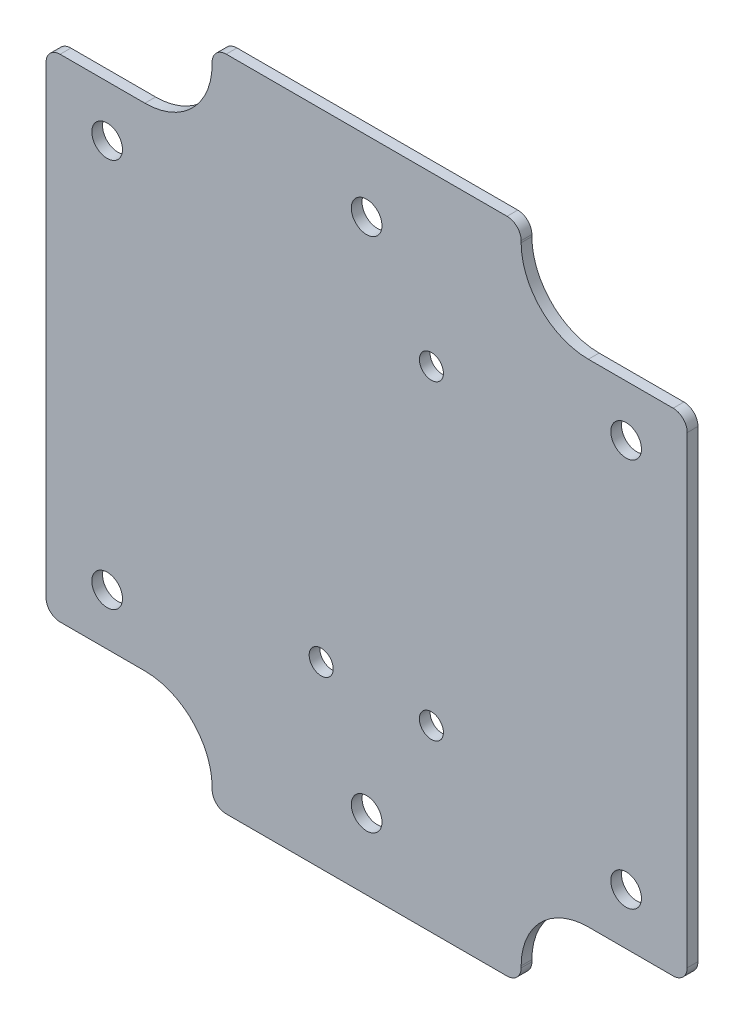
ISO-10303-21;
HEADER;
FILE_DESCRIPTION(('STEP AP214'),'2;1');
FILE_NAME('part.step','',(''),(''),'','','');
FILE_SCHEMA(('AUTOMOTIVE_DESIGN { 1 0 10303 214 1 1 1 1 }'));
ENDSEC;
DATA;
#1=APPLICATION_CONTEXT('core data for automotive mechanical design processes');
#2=APPLICATION_PROTOCOL_DEFINITION('international standard','automotive_design',2000,#1);
#3=PRODUCT_CONTEXT('',#1,'mechanical');
#4=PRODUCT('Part','Part','',(#3));
#5=PRODUCT_RELATED_PRODUCT_CATEGORY('part','',(#4));
#6=PRODUCT_DEFINITION_FORMATION('','',#4);
#7=PRODUCT_DEFINITION_CONTEXT('part definition',#1,'design');
#8=PRODUCT_DEFINITION('design','',#6,#7);
#9=PRODUCT_DEFINITION_SHAPE('','',#8);
#10=(LENGTH_UNIT() NAMED_UNIT(*) SI_UNIT(.MILLI.,.METRE.));
#11=(NAMED_UNIT(*) PLANE_ANGLE_UNIT() SI_UNIT($,.RADIAN.));
#12=(NAMED_UNIT(*) SI_UNIT($,.STERADIAN.) SOLID_ANGLE_UNIT());
#13=UNCERTAINTY_MEASURE_WITH_UNIT(LENGTH_MEASURE(1.E-05),#10,'distance_accuracy_value','');
#14=(GEOMETRIC_REPRESENTATION_CONTEXT(3) GLOBAL_UNCERTAINTY_ASSIGNED_CONTEXT((#13)) GLOBAL_UNIT_ASSIGNED_CONTEXT((#10,
#11,#12)) REPRESENTATION_CONTEXT('',''));
#15=CARTESIAN_POINT('',(0.,0.,0.));
#16=DIRECTION('',(0.,0.,1.));
#17=DIRECTION('',(1.,0.,0.));
#18=AXIS2_PLACEMENT_3D('',#15,#16,#17);
#19=CARTESIAN_POINT('',(0.,0.,1.2));
#20=DIRECTION('',(0.,0.,1.));
#21=DIRECTION('',(1.,0.,0.));
#22=AXIS2_PLACEMENT_3D('',#19,#20,#21);
#23=PLANE('',#22);
#24=CARTESIAN_POINT('',(30.7594,-16.76,1.2));
#25=DIRECTION('',(0.,0.,1.));
#26=DIRECTION('',(1.,0.,0.));
#27=AXIS2_PLACEMENT_3D('',#24,#25,#26);
#28=CIRCLE('',#27,1.345);
#29=CARTESIAN_POINT('',(32.1044,-16.76,1.2));
#30=VERTEX_POINT('',#29);
#31=EDGE_CURVE('E552',#30,#30,#28,.T.);
#32=ORIENTED_EDGE('',*,*,#31,.F.);
#33=EDGE_LOOP('',(#32));
#34=FACE_BOUND('',#33,.T.);
#35=CARTESIAN_POINT('',(43.0794,-16.76,1.2));
#36=DIRECTION('',(0.,0.,1.));
#37=DIRECTION('',(1.,0.,0.));
#38=AXIS2_PLACEMENT_3D('',#35,#36,#37);
#39=CIRCLE('',#38,1.345);
#40=CARTESIAN_POINT('',(44.4244,-16.76,1.2));
#41=VERTEX_POINT('',#40);
#42=EDGE_CURVE('E545',#41,#41,#39,.T.);
#43=ORIENTED_EDGE('',*,*,#42,.F.);
#44=EDGE_LOOP('',(#43));
#45=FACE_BOUND('',#44,.T.);
#46=CARTESIAN_POINT('',(43.0794,18.02,1.2));
#47=DIRECTION('',(0.,0.,1.));
#48=DIRECTION('',(1.,0.,0.));
#49=AXIS2_PLACEMENT_3D('',#46,#47,#48);
#50=CIRCLE('',#49,1.345);
#51=CARTESIAN_POINT('',(44.4244,18.02,1.2));
#52=VERTEX_POINT('',#51);
#53=EDGE_CURVE('E546',#52,#52,#50,.T.);
#54=ORIENTED_EDGE('',*,*,#53,.F.);
#55=EDGE_LOOP('',(#54));
#56=FACE_BOUND('',#55,.T.);
#57=CARTESIAN_POINT('',(35.8394,-28.8671,1.2));
#58=DIRECTION('',(0.,0.,1.));
#59=DIRECTION('',(1.,0.,0.));
#60=AXIS2_PLACEMENT_3D('',#57,#58,#59);
#61=CIRCLE('',#60,1.7145);
#62=CARTESIAN_POINT('',(37.5539,-28.8671,1.2));
#63=VERTEX_POINT('',#62);
#64=EDGE_CURVE('E527',#63,#63,#61,.T.);
#65=ORIENTED_EDGE('',*,*,#64,.F.);
#66=EDGE_LOOP('',(#65));
#67=FACE_BOUND('',#66,.T.);
#68=CARTESIAN_POINT('',(6.8326,21.7424,1.2));
#69=DIRECTION('',(0.,0.,1.));
#70=DIRECTION('',(1.,0.,0.));
#71=AXIS2_PLACEMENT_3D('',#68,#69,#70);
#72=CIRCLE('',#71,1.7145);
#73=CARTESIAN_POINT('',(8.5471,21.7424,1.2));
#74=VERTEX_POINT('',#73);
#75=EDGE_CURVE('E515',#74,#74,#72,.T.);
#76=ORIENTED_EDGE('',*,*,#75,.F.);
#77=EDGE_LOOP('',(#76));
#78=FACE_BOUND('',#77,.T.);
#79=CARTESIAN_POINT('',(64.8462,-21.7424,1.2));
#80=DIRECTION('',(0.,0.,1.));
#81=DIRECTION('',(1.,0.,0.));
#82=AXIS2_PLACEMENT_3D('',#79,#80,#81);
#83=CIRCLE('',#82,1.7145);
#84=CARTESIAN_POINT('',(66.5607,-21.7424,1.2));
#85=VERTEX_POINT('',#84);
#86=EDGE_CURVE('E226',#85,#85,#83,.T.);
#87=ORIENTED_EDGE('',*,*,#86,.F.);
#88=EDGE_LOOP('',(#87));
#89=FACE_BOUND('',#88,.T.);
#90=DIRECTION('',(0.,-1.,0.));
#91=VECTOR('',#90,1.);
#92=CARTESIAN_POINT('',(18.5674,-36.7792,1.2));
#93=LINE('',#92,#91);
#94=CARTESIAN_POINT('',(18.5674,-35.0012,1.2));
#95=VERTEX_POINT('',#94);
#96=CARTESIAN_POINT('',(18.5674,-35.2044,1.2));
#97=VERTEX_POINT('',#96);
#98=EDGE_CURVE('E386',#95,#97,#93,.T.);
#99=ORIENTED_EDGE('',*,*,#98,.T.);
#100=CARTESIAN_POINT('',(20.1422,-35.2044,1.2));
#101=DIRECTION('',(0.,0.,1.));
#102=DIRECTION('',(1.,0.,0.));
#103=AXIS2_PLACEMENT_3D('',#100,#101,#102);
#104=CIRCLE('',#103,1.5748);
#105=CARTESIAN_POINT('',(20.1422,-36.7792,1.2));
#106=VERTEX_POINT('',#105);
#107=EDGE_CURVE('E330',#97,#106,#104,.T.);
#108=ORIENTED_EDGE('',*,*,#107,.T.);
#109=DIRECTION('',(1.,0.,0.));
#110=VECTOR('',#109,1.);
#111=CARTESIAN_POINT('',(53.1114,-36.7792,1.2));
#112=LINE('',#111,#110);
#113=CARTESIAN_POINT('',(51.5366,-36.7792,1.2));
#114=VERTEX_POINT('',#113);
#115=EDGE_CURVE('E388',#106,#114,#112,.T.);
#116=ORIENTED_EDGE('',*,*,#115,.T.);
#117=CARTESIAN_POINT('',(51.5366,-35.2044,1.2));
#118=DIRECTION('',(0.,0.,1.));
#119=DIRECTION('',(1.,0.,0.));
#120=AXIS2_PLACEMENT_3D('',#117,#118,#119);
#121=CIRCLE('',#120,1.5748);
#122=CARTESIAN_POINT('',(53.1114,-35.2044,1.2));
#123=VERTEX_POINT('',#122);
#124=EDGE_CURVE('E328',#114,#123,#121,.T.);
#125=ORIENTED_EDGE('',*,*,#124,.T.);
#126=DIRECTION('',(0.,1.,0.));
#127=VECTOR('',#126,1.);
#128=CARTESIAN_POINT('',(53.1114,-27.4828,1.2));
#129=LINE('',#128,#127);
#130=CARTESIAN_POINT('',(53.1114,-35.0012,1.2));
#131=VERTEX_POINT('',#130);
#132=EDGE_CURVE('E218',#123,#131,#129,.T.);
#133=ORIENTED_EDGE('',*,*,#132,.T.);
#134=CARTESIAN_POINT('',(60.6298,-35.0012,1.2));
#135=DIRECTION('',(0.,0.,1.));
#136=DIRECTION('',(1.,0.,0.));
#137=AXIS2_PLACEMENT_3D('',#134,#135,#136);
#138=CIRCLE('',#137,7.5184);
#139=CARTESIAN_POINT('',(60.6298,-27.4828,1.2));
#140=VERTEX_POINT('',#139);
#141=EDGE_CURVE('E207',#131,#140,#138,.F.);
#142=ORIENTED_EDGE('',*,*,#141,.T.);
#143=DIRECTION('',(1.,0.,0.));
#144=VECTOR('',#143,1.);
#145=CARTESIAN_POINT('',(71.6788,-27.4828,1.2));
#146=LINE('',#145,#144);
#147=CARTESIAN_POINT('',(70.104,-27.4828,1.2));
#148=VERTEX_POINT('',#147);
#149=EDGE_CURVE('E217',#140,#148,#146,.T.);
#150=ORIENTED_EDGE('',*,*,#149,.T.);
#151=CARTESIAN_POINT('',(70.104,-25.908,1.2));
#152=DIRECTION('',(0.,0.,1.));
#153=DIRECTION('',(1.,0.,0.));
#154=AXIS2_PLACEMENT_3D('',#151,#152,#153);
#155=CIRCLE('',#154,1.5748);
#156=CARTESIAN_POINT('',(71.6788,-25.908,1.2));
#157=VERTEX_POINT('',#156);
#158=EDGE_CURVE('E326',#148,#157,#155,.T.);
#159=ORIENTED_EDGE('',*,*,#158,.T.);
#160=DIRECTION('',(0.,1.,0.));
#161=VECTOR('',#160,1.);
#162=CARTESIAN_POINT('',(71.6788,-27.4828,1.2));
#163=LINE('',#162,#161);
#164=CARTESIAN_POINT('',(71.6788,25.908,1.2));
#165=VERTEX_POINT('',#164);
#166=EDGE_CURVE('E505',#157,#165,#163,.T.);
#167=ORIENTED_EDGE('',*,*,#166,.T.);
#168=CARTESIAN_POINT('',(70.104,25.908,1.2));
#169=DIRECTION('',(0.,0.,1.));
#170=DIRECTION('',(1.,0.,0.));
#171=AXIS2_PLACEMENT_3D('',#168,#169,#170);
#172=CIRCLE('',#171,1.5748);
#173=CARTESIAN_POINT('',(70.104,27.4828,1.2));
#174=VERTEX_POINT('',#173);
#175=EDGE_CURVE('E324',#165,#174,#172,.T.);
#176=ORIENTED_EDGE('',*,*,#175,.T.);
#177=DIRECTION('',(-1.,0.,0.));
#178=VECTOR('',#177,1.);
#179=CARTESIAN_POINT('',(71.6788,27.4828,1.2));
#180=LINE('',#179,#178);
#181=CARTESIAN_POINT('',(60.6298,27.4828,1.2));
#182=VERTEX_POINT('',#181);
#183=EDGE_CURVE('E501',#174,#182,#180,.T.);
#184=ORIENTED_EDGE('',*,*,#183,.T.);
#185=CARTESIAN_POINT('',(60.6298,35.0012,1.2));
#186=DIRECTION('',(0.,0.,1.));
#187=DIRECTION('',(1.,0.,0.));
#188=AXIS2_PLACEMENT_3D('',#185,#186,#187);
#189=CIRCLE('',#188,7.5184);
#190=CARTESIAN_POINT('',(53.1114,35.0012,1.2));
#191=VERTEX_POINT('',#190);
#192=EDGE_CURVE('E288',#182,#191,#189,.F.);
#193=ORIENTED_EDGE('',*,*,#192,.T.);
#194=DIRECTION('',(0.,1.,0.));
#195=VECTOR('',#194,1.);
#196=CARTESIAN_POINT('',(53.1114,27.4828,1.2));
#197=LINE('',#196,#195);
#198=CARTESIAN_POINT('',(53.1114,35.2044,1.2));
#199=VERTEX_POINT('',#198);
#200=EDGE_CURVE('E498',#191,#199,#197,.T.);
#201=ORIENTED_EDGE('',*,*,#200,.T.);
#202=CARTESIAN_POINT('',(51.5366,35.2044,1.2));
#203=DIRECTION('',(0.,0.,1.));
#204=DIRECTION('',(1.,0.,0.));
#205=AXIS2_PLACEMENT_3D('',#202,#203,#204);
#206=CIRCLE('',#205,1.5748);
#207=CARTESIAN_POINT('',(51.5366,36.7792,1.2));
#208=VERTEX_POINT('',#207);
#209=EDGE_CURVE('E322',#199,#208,#206,.T.);
#210=ORIENTED_EDGE('',*,*,#209,.T.);
#211=DIRECTION('',(-1.,0.,0.));
#212=VECTOR('',#211,1.);
#213=CARTESIAN_POINT('',(53.1114,36.7792,1.2));
#214=LINE('',#213,#212);
#215=CARTESIAN_POINT('',(20.1422,36.7792,1.2));
#216=VERTEX_POINT('',#215);
#217=EDGE_CURVE('E494',#208,#216,#214,.T.);
#218=ORIENTED_EDGE('',*,*,#217,.T.);
#219=CARTESIAN_POINT('',(20.1422,35.2044,1.2));
#220=DIRECTION('',(0.,0.,1.));
#221=DIRECTION('',(1.,0.,0.));
#222=AXIS2_PLACEMENT_3D('',#219,#220,#221);
#223=CIRCLE('',#222,1.5748);
#224=CARTESIAN_POINT('',(18.5674,35.2044,1.2));
#225=VERTEX_POINT('',#224);
#226=EDGE_CURVE('E320',#216,#225,#223,.T.);
#227=ORIENTED_EDGE('',*,*,#226,.T.);
#228=DIRECTION('',(0.,-1.,0.));
#229=VECTOR('',#228,1.);
#230=CARTESIAN_POINT('',(18.5674,36.7792,1.2));
#231=LINE('',#230,#229);
#232=CARTESIAN_POINT('',(18.5674,35.0012,1.2));
#233=VERTEX_POINT('',#232);
#234=EDGE_CURVE('E372',#225,#233,#231,.T.);
#235=ORIENTED_EDGE('',*,*,#234,.T.);
#236=CARTESIAN_POINT('',(11.049,35.0012,1.2));
#237=DIRECTION('',(0.,0.,1.));
#238=DIRECTION('',(1.,0.,0.));
#239=AXIS2_PLACEMENT_3D('',#236,#237,#238);
#240=CIRCLE('',#239,7.5184);
#241=CARTESIAN_POINT('',(11.049,27.4828,1.2));
#242=VERTEX_POINT('',#241);
#243=EDGE_CURVE('E293',#233,#242,#240,.F.);
#244=ORIENTED_EDGE('',*,*,#243,.T.);
#245=DIRECTION('',(-1.,0.,0.));
#246=VECTOR('',#245,1.);
#247=CARTESIAN_POINT('',(18.5674,27.4828,1.2));
#248=LINE('',#247,#246);
#249=CARTESIAN_POINT('',(1.5748,27.4828,1.2));
#250=VERTEX_POINT('',#249);
#251=EDGE_CURVE('E363',#242,#250,#248,.T.);
#252=ORIENTED_EDGE('',*,*,#251,.T.);
#253=CARTESIAN_POINT('',(1.5748,25.908,1.2));
#254=DIRECTION('',(0.,0.,1.));
#255=DIRECTION('',(1.,0.,0.));
#256=AXIS2_PLACEMENT_3D('',#253,#254,#255);
#257=CIRCLE('',#256,1.5748);
#258=CARTESIAN_POINT('',(0.,25.908,1.2));
#259=VERTEX_POINT('',#258);
#260=EDGE_CURVE('E318',#250,#259,#257,.T.);
#261=ORIENTED_EDGE('',*,*,#260,.T.);
#262=DIRECTION('',(0.,-1.,0.));
#263=VECTOR('',#262,1.);
#264=CARTESIAN_POINT('',(0.,-27.4828,1.2));
#265=LINE('',#264,#263);
#266=CARTESIAN_POINT('',(0.,-25.908,1.2));
#267=VERTEX_POINT('',#266);
#268=EDGE_CURVE('E371',#259,#267,#265,.T.);
#269=ORIENTED_EDGE('',*,*,#268,.T.);
#270=CARTESIAN_POINT('',(1.5748,-25.908,1.2));
#271=DIRECTION('',(0.,0.,1.));
#272=DIRECTION('',(1.,0.,0.));
#273=AXIS2_PLACEMENT_3D('',#270,#271,#272);
#274=CIRCLE('',#273,1.5748);
#275=CARTESIAN_POINT('',(1.5748,-27.4828,1.2));
#276=VERTEX_POINT('',#275);
#277=EDGE_CURVE('E48',#267,#276,#274,.T.);
#278=ORIENTED_EDGE('',*,*,#277,.T.);
#279=DIRECTION('',(1.,0.,0.));
#280=VECTOR('',#279,1.);
#281=CARTESIAN_POINT('',(18.5674,-27.4828,1.2));
#282=LINE('',#281,#280);
#283=CARTESIAN_POINT('',(11.049,-27.4828,1.2));
#284=VERTEX_POINT('',#283);
#285=EDGE_CURVE('E383',#276,#284,#282,.T.);
#286=ORIENTED_EDGE('',*,*,#285,.T.);
#287=CARTESIAN_POINT('',(11.049,-35.0012,1.2));
#288=DIRECTION('',(0.,0.,1.));
#289=DIRECTION('',(1.,0.,0.));
#290=AXIS2_PLACEMENT_3D('',#287,#288,#289);
#291=CIRCLE('',#290,7.5184);
#292=EDGE_CURVE('E283',#284,#95,#291,.F.);
#293=ORIENTED_EDGE('',*,*,#292,.T.);
#294=EDGE_LOOP('',(#99,#108,#116,#125,#133,#142,#150,#159,#167,#176,#184,#193,#201,#210,#218,
#227,#235,#244,#252,#261,#269,#278,#286,#293));
#295=FACE_BOUND('',#294,.T.);
#296=CARTESIAN_POINT('',(6.83260000000001,-21.7424,1.2));
#297=DIRECTION('',(0.,0.,1.));
#298=DIRECTION('',(-1.,0.,0.));
#299=AXIS2_PLACEMENT_3D('',#296,#297,#298);
#300=CIRCLE('',#299,1.7145);
#301=CARTESIAN_POINT('',(5.11810000000001,-21.7424,1.2));
#302=VERTEX_POINT('',#301);
#303=EDGE_CURVE('E510',#302,#302,#300,.T.);
#304=ORIENTED_EDGE('',*,*,#303,.F.);
#305=EDGE_LOOP('',(#304));
#306=FACE_BOUND('',#305,.T.);
#307=CARTESIAN_POINT('',(64.8462,21.7424,1.2));
#308=DIRECTION('',(0.,0.,1.));
#309=DIRECTION('',(-1.,0.,0.));
#310=AXIS2_PLACEMENT_3D('',#307,#308,#309);
#311=CIRCLE('',#310,1.7145);
#312=CARTESIAN_POINT('',(63.1317,21.7424,1.2));
#313=VERTEX_POINT('',#312);
#314=EDGE_CURVE('E521',#313,#313,#311,.T.);
#315=ORIENTED_EDGE('',*,*,#314,.F.);
#316=EDGE_LOOP('',(#315));
#317=FACE_BOUND('',#316,.T.);
#318=CARTESIAN_POINT('',(35.8394,28.8671,1.2));
#319=DIRECTION('',(0.,0.,1.));
#320=DIRECTION('',(-1.,0.,0.));
#321=AXIS2_PLACEMENT_3D('',#318,#319,#320);
#322=CIRCLE('',#321,1.7145);
#323=CARTESIAN_POINT('',(34.1249,28.8671,1.2));
#324=VERTEX_POINT('',#323);
#325=EDGE_CURVE('E533',#324,#324,#322,.T.);
#326=ORIENTED_EDGE('',*,*,#325,.F.);
#327=EDGE_LOOP('',(#326));
#328=FACE_BOUND('',#327,.T.);
#329=ADVANCED_FACE('F33',(#34,#45,#56,#67,#78,#89,#295,#306,#317,#328),#23,.T.);
#330=CARTESIAN_POINT('',(0.,0.,0.));
#331=DIRECTION('',(0.,0.,1.));
#332=DIRECTION('',(1.,0.,0.));
#333=AXIS2_PLACEMENT_3D('',#330,#331,#332);
#334=PLANE('',#333);
#335=CARTESIAN_POINT('',(30.7594,-16.76,0.));
#336=DIRECTION('',(0.,0.,1.));
#337=DIRECTION('',(1.,0.,0.));
#338=AXIS2_PLACEMENT_3D('',#335,#336,#337);
#339=CIRCLE('',#338,1.345);
#340=CARTESIAN_POINT('',(32.1044,-16.76,0.));
#341=VERTEX_POINT('',#340);
#342=EDGE_CURVE('E539',#341,#341,#339,.F.);
#343=ORIENTED_EDGE('',*,*,#342,.F.);
#344=EDGE_LOOP('',(#343));
#345=FACE_BOUND('',#344,.T.);
#346=CARTESIAN_POINT('',(43.0794,-16.76,0.));
#347=DIRECTION('',(0.,0.,1.));
#348=DIRECTION('',(1.,0.,0.));
#349=AXIS2_PLACEMENT_3D('',#346,#347,#348);
#350=CIRCLE('',#349,1.345);
#351=CARTESIAN_POINT('',(44.4244,-16.76,0.));
#352=VERTEX_POINT('',#351);
#353=EDGE_CURVE('E549',#352,#352,#350,.F.);
#354=ORIENTED_EDGE('',*,*,#353,.F.);
#355=EDGE_LOOP('',(#354));
#356=FACE_BOUND('',#355,.T.);
#357=CARTESIAN_POINT('',(43.0794,18.02,0.));
#358=DIRECTION('',(0.,0.,1.));
#359=DIRECTION('',(1.,0.,0.));
#360=AXIS2_PLACEMENT_3D('',#357,#358,#359);
#361=CIRCLE('',#360,1.345);
#362=CARTESIAN_POINT('',(44.4244,18.02,0.));
#363=VERTEX_POINT('',#362);
#364=EDGE_CURVE('E542',#363,#363,#361,.F.);
#365=ORIENTED_EDGE('',*,*,#364,.F.);
#366=EDGE_LOOP('',(#365));
#367=FACE_BOUND('',#366,.T.);
#368=DIRECTION('',(1.,0.,0.));
#369=VECTOR('',#368,1.);
#370=CARTESIAN_POINT('',(53.1114,-36.7792,0.));
#371=LINE('',#370,#369);
#372=CARTESIAN_POINT('',(20.1422,-36.7792,0.));
#373=VERTEX_POINT('',#372);
#374=CARTESIAN_POINT('',(51.5366,-36.7792,0.));
#375=VERTEX_POINT('',#374);
#376=EDGE_CURVE('E256',#373,#375,#371,.T.);
#377=ORIENTED_EDGE('',*,*,#376,.F.);
#378=CARTESIAN_POINT('',(20.1422,-35.2044,0.));
#379=DIRECTION('',(0.,0.,1.));
#380=DIRECTION('',(1.,0.,0.));
#381=AXIS2_PLACEMENT_3D('',#378,#379,#380);
#382=CIRCLE('',#381,1.5748);
#383=CARTESIAN_POINT('',(18.5674,-35.2044,0.));
#384=VERTEX_POINT('',#383);
#385=EDGE_CURVE('E313',#373,#384,#382,.F.);
#386=ORIENTED_EDGE('',*,*,#385,.T.);
#387=DIRECTION('',(0.,-1.,0.));
#388=VECTOR('',#387,1.);
#389=CARTESIAN_POINT('',(18.5674,-36.7792,0.));
#390=LINE('',#389,#388);
#391=CARTESIAN_POINT('',(18.5674,-35.0012,0.));
#392=VERTEX_POINT('',#391);
#393=EDGE_CURVE('E253',#392,#384,#390,.T.);
#394=ORIENTED_EDGE('',*,*,#393,.F.);
#395=CARTESIAN_POINT('',(11.049,-35.0012,0.));
#396=DIRECTION('',(0.,0.,1.));
#397=DIRECTION('',(1.,0.,0.));
#398=AXIS2_PLACEMENT_3D('',#395,#396,#397);
#399=CIRCLE('',#398,7.5184);
#400=CARTESIAN_POINT('',(11.049,-27.4828,0.));
#401=VERTEX_POINT('',#400);
#402=EDGE_CURVE('E280',#392,#401,#399,.T.);
#403=ORIENTED_EDGE('',*,*,#402,.T.);
#404=DIRECTION('',(1.,0.,0.));
#405=VECTOR('',#404,1.);
#406=CARTESIAN_POINT('',(18.5674,-27.4828,0.));
#407=LINE('',#406,#405);
#408=CARTESIAN_POINT('',(1.5748,-27.4828,0.));
#409=VERTEX_POINT('',#408);
#410=EDGE_CURVE('E251',#409,#401,#407,.T.);
#411=ORIENTED_EDGE('',*,*,#410,.F.);
#412=CARTESIAN_POINT('',(1.5748,-25.908,0.));
#413=DIRECTION('',(0.,0.,1.));
#414=DIRECTION('',(1.,0.,0.));
#415=AXIS2_PLACEMENT_3D('',#412,#413,#414);
#416=CIRCLE('',#415,1.5748);
#417=CARTESIAN_POINT('',(0.,-25.908,0.));
#418=VERTEX_POINT('',#417);
#419=EDGE_CURVE('E300',#409,#418,#416,.F.);
#420=ORIENTED_EDGE('',*,*,#419,.T.);
#421=DIRECTION('',(0.,-1.,0.));
#422=VECTOR('',#421,1.);
#423=CARTESIAN_POINT('',(0.,-27.4828,0.));
#424=LINE('',#423,#422);
#425=CARTESIAN_POINT('',(0.,25.908,0.));
#426=VERTEX_POINT('',#425);
#427=EDGE_CURVE('E249',#426,#418,#424,.T.);
#428=ORIENTED_EDGE('',*,*,#427,.F.);
#429=CARTESIAN_POINT('',(1.5748,25.908,0.));
#430=DIRECTION('',(0.,0.,1.));
#431=DIRECTION('',(1.,0.,0.));
#432=AXIS2_PLACEMENT_3D('',#429,#430,#431);
#433=CIRCLE('',#432,1.5748);
#434=CARTESIAN_POINT('',(1.5748,27.4828,0.));
#435=VERTEX_POINT('',#434);
#436=EDGE_CURVE('E302',#426,#435,#433,.F.);
#437=ORIENTED_EDGE('',*,*,#436,.T.);
#438=DIRECTION('',(-1.,0.,0.));
#439=VECTOR('',#438,1.);
#440=CARTESIAN_POINT('',(18.5674,27.4828,0.));
#441=LINE('',#440,#439);
#442=CARTESIAN_POINT('',(11.049,27.4828,0.));
#443=VERTEX_POINT('',#442);
#444=EDGE_CURVE('E246',#443,#435,#441,.T.);
#445=ORIENTED_EDGE('',*,*,#444,.F.);
#446=CARTESIAN_POINT('',(11.049,35.0012,0.));
#447=DIRECTION('',(0.,0.,1.));
#448=DIRECTION('',(1.,0.,0.));
#449=AXIS2_PLACEMENT_3D('',#446,#447,#448);
#450=CIRCLE('',#449,7.5184);
#451=CARTESIAN_POINT('',(18.5674,35.0012,0.));
#452=VERTEX_POINT('',#451);
#453=EDGE_CURVE('E290',#443,#452,#450,.T.);
#454=ORIENTED_EDGE('',*,*,#453,.T.);
#455=DIRECTION('',(0.,-1.,0.));
#456=VECTOR('',#455,1.);
#457=CARTESIAN_POINT('',(18.5674,36.7792,0.));
#458=LINE('',#457,#456);
#459=CARTESIAN_POINT('',(18.5674,35.2044,0.));
#460=VERTEX_POINT('',#459);
#461=EDGE_CURVE('E244',#460,#452,#458,.T.);
#462=ORIENTED_EDGE('',*,*,#461,.F.);
#463=CARTESIAN_POINT('',(20.1422,35.2044,0.));
#464=DIRECTION('',(0.,0.,1.));
#465=DIRECTION('',(1.,0.,0.));
#466=AXIS2_PLACEMENT_3D('',#463,#464,#465);
#467=CIRCLE('',#466,1.5748);
#468=CARTESIAN_POINT('',(20.1422,36.7792,0.));
#469=VERTEX_POINT('',#468);
#470=EDGE_CURVE('E304',#460,#469,#467,.F.);
#471=ORIENTED_EDGE('',*,*,#470,.T.);
#472=DIRECTION('',(-1.,0.,0.));
#473=VECTOR('',#472,1.);
#474=CARTESIAN_POINT('',(53.1114,36.7792,0.));
#475=LINE('',#474,#473);
#476=CARTESIAN_POINT('',(51.5366,36.7792,0.));
#477=VERTEX_POINT('',#476);
#478=EDGE_CURVE('E241',#477,#469,#475,.T.);
#479=ORIENTED_EDGE('',*,*,#478,.F.);
#480=CARTESIAN_POINT('',(51.5366,35.2044,0.));
#481=DIRECTION('',(0.,0.,1.));
#482=DIRECTION('',(1.,0.,0.));
#483=AXIS2_PLACEMENT_3D('',#480,#481,#482);
#484=CIRCLE('',#483,1.5748);
#485=CARTESIAN_POINT('',(53.1114,35.2044,0.));
#486=VERTEX_POINT('',#485);
#487=EDGE_CURVE('E306',#477,#486,#484,.F.);
#488=ORIENTED_EDGE('',*,*,#487,.T.);
#489=DIRECTION('',(0.,1.,0.));
#490=VECTOR('',#489,1.);
#491=CARTESIAN_POINT('',(53.1114,27.4828,0.));
#492=LINE('',#491,#490);
#493=CARTESIAN_POINT('',(53.1114,35.0012,0.));
#494=VERTEX_POINT('',#493);
#495=EDGE_CURVE('E238',#494,#486,#492,.T.);
#496=ORIENTED_EDGE('',*,*,#495,.F.);
#497=CARTESIAN_POINT('',(60.6298,35.0012,0.));
#498=DIRECTION('',(0.,0.,1.));
#499=DIRECTION('',(1.,0.,0.));
#500=AXIS2_PLACEMENT_3D('',#497,#498,#499);
#501=CIRCLE('',#500,7.5184);
#502=CARTESIAN_POINT('',(60.6298,27.4828,0.));
#503=VERTEX_POINT('',#502);
#504=EDGE_CURVE('E285',#494,#503,#501,.T.);
#505=ORIENTED_EDGE('',*,*,#504,.T.);
#506=DIRECTION('',(-1.,0.,0.));
#507=VECTOR('',#506,1.);
#508=CARTESIAN_POINT('',(71.6788,27.4828,0.));
#509=LINE('',#508,#507);
#510=CARTESIAN_POINT('',(70.104,27.4828,0.));
#511=VERTEX_POINT('',#510);
#512=EDGE_CURVE('E229',#511,#503,#509,.T.);
#513=ORIENTED_EDGE('',*,*,#512,.F.);
#514=CARTESIAN_POINT('',(70.104,25.908,0.));
#515=DIRECTION('',(0.,0.,1.));
#516=DIRECTION('',(1.,0.,0.));
#517=AXIS2_PLACEMENT_3D('',#514,#515,#516);
#518=CIRCLE('',#517,1.5748);
#519=CARTESIAN_POINT('',(71.6788,25.908,0.));
#520=VERTEX_POINT('',#519);
#521=EDGE_CURVE('E308',#511,#520,#518,.F.);
#522=ORIENTED_EDGE('',*,*,#521,.T.);
#523=DIRECTION('',(0.,1.,0.));
#524=VECTOR('',#523,1.);
#525=CARTESIAN_POINT('',(71.6788,-27.4828,0.));
#526=LINE('',#525,#524);
#527=CARTESIAN_POINT('',(71.6788,-25.908,0.));
#528=VERTEX_POINT('',#527);
#529=EDGE_CURVE('E225',#528,#520,#526,.T.);
#530=ORIENTED_EDGE('',*,*,#529,.F.);
#531=CARTESIAN_POINT('',(70.104,-25.908,0.));
#532=DIRECTION('',(0.,0.,1.));
#533=DIRECTION('',(1.,0.,0.));
#534=AXIS2_PLACEMENT_3D('',#531,#532,#533);
#535=CIRCLE('',#534,1.5748);
#536=CARTESIAN_POINT('',(70.104,-27.4828,0.));
#537=VERTEX_POINT('',#536);
#538=EDGE_CURVE('E224',#528,#537,#535,.F.);
#539=ORIENTED_EDGE('',*,*,#538,.T.);
#540=DIRECTION('',(1.,0.,0.));
#541=VECTOR('',#540,1.);
#542=CARTESIAN_POINT('',(71.6788,-27.4828,0.));
#543=LINE('',#542,#541);
#544=CARTESIAN_POINT('',(60.6298,-27.4828,0.));
#545=VERTEX_POINT('',#544);
#546=EDGE_CURVE('E214',#545,#537,#543,.T.);
#547=ORIENTED_EDGE('',*,*,#546,.F.);
#548=CARTESIAN_POINT('',(60.6298,-35.0012,0.));
#549=DIRECTION('',(0.,0.,1.));
#550=DIRECTION('',(1.,0.,0.));
#551=AXIS2_PLACEMENT_3D('',#548,#549,#550);
#552=CIRCLE('',#551,7.5184);
#553=CARTESIAN_POINT('',(53.1114,-35.0012,0.));
#554=VERTEX_POINT('',#553);
#555=EDGE_CURVE('E197',#545,#554,#552,.T.);
#556=ORIENTED_EDGE('',*,*,#555,.T.);
#557=DIRECTION('',(0.,1.,0.));
#558=VECTOR('',#557,1.);
#559=CARTESIAN_POINT('',(53.1114,-27.4828,0.));
#560=LINE('',#559,#558);
#561=CARTESIAN_POINT('',(53.1114,-35.2044,0.));
#562=VERTEX_POINT('',#561);
#563=EDGE_CURVE('E259',#562,#554,#560,.T.);
#564=ORIENTED_EDGE('',*,*,#563,.F.);
#565=CARTESIAN_POINT('',(51.5366,-35.2044,0.));
#566=DIRECTION('',(0.,0.,1.));
#567=DIRECTION('',(1.,0.,0.));
#568=AXIS2_PLACEMENT_3D('',#565,#566,#567);
#569=CIRCLE('',#568,1.5748);
#570=EDGE_CURVE('E311',#562,#375,#569,.F.);
#571=ORIENTED_EDGE('',*,*,#570,.T.);
#572=EDGE_LOOP('',(#377,#386,#394,#403,#411,#420,#428,#437,#445,#454,#462,#471,#479,#488,#496,
#505,#513,#522,#530,#539,#547,#556,#564,#571));
#573=FACE_BOUND('',#572,.T.);
#574=CARTESIAN_POINT('',(64.8462,-21.7424,0.));
#575=DIRECTION('',(0.,0.,1.));
#576=DIRECTION('',(1.,0.,0.));
#577=AXIS2_PLACEMENT_3D('',#574,#575,#576);
#578=CIRCLE('',#577,1.7145);
#579=CARTESIAN_POINT('',(66.5607,-21.7424,0.));
#580=VERTEX_POINT('',#579);
#581=EDGE_CURVE('E232',#580,#580,#578,.T.);
#582=ORIENTED_EDGE('',*,*,#581,.T.);
#583=EDGE_LOOP('',(#582));
#584=FACE_BOUND('',#583,.T.);
#585=CARTESIAN_POINT('',(6.83260000000001,-21.7424,0.));
#586=DIRECTION('',(0.,0.,1.));
#587=DIRECTION('',(-1.,0.,0.));
#588=AXIS2_PLACEMENT_3D('',#585,#586,#587);
#589=CIRCLE('',#588,1.7145);
#590=CARTESIAN_POINT('',(5.11810000000001,-21.7424,0.));
#591=VERTEX_POINT('',#590);
#592=EDGE_CURVE('E512',#591,#591,#589,.T.);
#593=ORIENTED_EDGE('',*,*,#592,.T.);
#594=EDGE_LOOP('',(#593));
#595=FACE_BOUND('',#594,.T.);
#596=CARTESIAN_POINT('',(6.8326,21.7424,0.));
#597=DIRECTION('',(0.,0.,1.));
#598=DIRECTION('',(1.,0.,0.));
#599=AXIS2_PLACEMENT_3D('',#596,#597,#598);
#600=CIRCLE('',#599,1.7145);
#601=CARTESIAN_POINT('',(8.5471,21.7424,0.));
#602=VERTEX_POINT('',#601);
#603=EDGE_CURVE('E518',#602,#602,#600,.T.);
#604=ORIENTED_EDGE('',*,*,#603,.T.);
#605=EDGE_LOOP('',(#604));
#606=FACE_BOUND('',#605,.T.);
#607=CARTESIAN_POINT('',(64.8462,21.7424,0.));
#608=DIRECTION('',(0.,0.,1.));
#609=DIRECTION('',(-1.,0.,0.));
#610=AXIS2_PLACEMENT_3D('',#607,#608,#609);
#611=CIRCLE('',#610,1.7145);
#612=CARTESIAN_POINT('',(63.1317,21.7424,0.));
#613=VERTEX_POINT('',#612);
#614=EDGE_CURVE('E524',#613,#613,#611,.T.);
#615=ORIENTED_EDGE('',*,*,#614,.T.);
#616=EDGE_LOOP('',(#615));
#617=FACE_BOUND('',#616,.T.);
#618=CARTESIAN_POINT('',(35.8394,-28.8671,0.));
#619=DIRECTION('',(0.,0.,1.));
#620=DIRECTION('',(1.,0.,0.));
#621=AXIS2_PLACEMENT_3D('',#618,#619,#620);
#622=CIRCLE('',#621,1.7145);
#623=CARTESIAN_POINT('',(37.5539,-28.8671,0.));
#624=VERTEX_POINT('',#623);
#625=EDGE_CURVE('E530',#624,#624,#622,.T.);
#626=ORIENTED_EDGE('',*,*,#625,.T.);
#627=EDGE_LOOP('',(#626));
#628=FACE_BOUND('',#627,.T.);
#629=CARTESIAN_POINT('',(35.8394,28.8671,0.));
#630=DIRECTION('',(0.,0.,1.));
#631=DIRECTION('',(-1.,0.,0.));
#632=AXIS2_PLACEMENT_3D('',#629,#630,#631);
#633=CIRCLE('',#632,1.7145);
#634=CARTESIAN_POINT('',(34.1249,28.8671,0.));
#635=VERTEX_POINT('',#634);
#636=EDGE_CURVE('E536',#635,#635,#633,.T.);
#637=ORIENTED_EDGE('',*,*,#636,.T.);
#638=EDGE_LOOP('',(#637));
#639=FACE_BOUND('',#638,.T.);
#640=ADVANCED_FACE('F221',(#345,#356,#367,#573,#584,#595,#606,#617,#628,#639),#334,.F.);
#641=CARTESIAN_POINT('',(71.6788,-27.4828,1.2));
#642=DIRECTION('',(0.,1.,0.));
#643=DIRECTION('',(-1.,0.,0.));
#644=AXIS2_PLACEMENT_3D('',#641,#642,#643);
#645=PLANE('',#644);
#646=ORIENTED_EDGE('',*,*,#546,.T.);
#647=DIRECTION('',(0.,0.,-1.));
#648=VECTOR('',#647,1.);
#649=CARTESIAN_POINT('',(70.104,-27.4828,1.2));
#650=LINE('',#649,#648);
#651=EDGE_CURVE('E340',#537,#148,#650,.F.);
#652=ORIENTED_EDGE('',*,*,#651,.T.);
#653=ORIENTED_EDGE('',*,*,#149,.F.);
#654=DIRECTION('',(0.,0.,-1.));
#655=VECTOR('',#654,1.);
#656=CARTESIAN_POINT('',(60.6298,-27.4828,0.));
#657=LINE('',#656,#655);
#658=EDGE_CURVE('E201',#140,#545,#657,.T.);
#659=ORIENTED_EDGE('',*,*,#658,.T.);
#660=EDGE_LOOP('',(#646,#652,#653,#659));
#661=FACE_BOUND('',#660,.T.);
#662=ADVANCED_FACE('F213',(#661),#645,.F.);
#663=CARTESIAN_POINT('',(71.6788,-27.4828,1.2));
#664=DIRECTION('',(-1.,0.,0.));
#665=DIRECTION('',(0.,0.,1.));
#666=AXIS2_PLACEMENT_3D('',#663,#664,#665);
#667=PLANE('',#666);
#668=ORIENTED_EDGE('',*,*,#166,.F.);
#669=DIRECTION('',(0.,0.,-1.));
#670=VECTOR('',#669,1.);
#671=CARTESIAN_POINT('',(71.6788,-25.908,1.2));
#672=LINE('',#671,#670);
#673=EDGE_CURVE('E337',#157,#528,#672,.T.);
#674=ORIENTED_EDGE('',*,*,#673,.T.);
#675=ORIENTED_EDGE('',*,*,#529,.T.);
#676=DIRECTION('',(0.,0.,-1.));
#677=VECTOR('',#676,1.);
#678=CARTESIAN_POINT('',(71.6788,25.908,1.2));
#679=LINE('',#678,#677);
#680=EDGE_CURVE('E335',#520,#165,#679,.F.);
#681=ORIENTED_EDGE('',*,*,#680,.T.);
#682=EDGE_LOOP('',(#668,#674,#675,#681));
#683=FACE_BOUND('',#682,.T.);
#684=ADVANCED_FACE('F461',(#683),#667,.F.);
#685=CARTESIAN_POINT('',(71.6788,27.4828,1.2));
#686=DIRECTION('',(0.,-1.,0.));
#687=DIRECTION('',(1.,0.,0.));
#688=AXIS2_PLACEMENT_3D('',#685,#686,#687);
#689=PLANE('',#688);
#690=ORIENTED_EDGE('',*,*,#183,.F.);
#691=DIRECTION('',(0.,0.,-1.));
#692=VECTOR('',#691,1.);
#693=CARTESIAN_POINT('',(70.104,27.4828,1.2));
#694=LINE('',#693,#692);
#695=EDGE_CURVE('E342',#174,#511,#694,.T.);
#696=ORIENTED_EDGE('',*,*,#695,.T.);
#697=ORIENTED_EDGE('',*,*,#512,.T.);
#698=DIRECTION('',(0.,0.,-1.));
#699=VECTOR('',#698,1.);
#700=CARTESIAN_POINT('',(60.6298,27.4828,1.2));
#701=LINE('',#700,#699);
#702=EDGE_CURVE('E271',#503,#182,#701,.F.);
#703=ORIENTED_EDGE('',*,*,#702,.T.);
#704=EDGE_LOOP('',(#690,#696,#697,#703));
#705=FACE_BOUND('',#704,.T.);
#706=ADVANCED_FACE('F457',(#705),#689,.F.);
#707=CARTESIAN_POINT('',(53.1114,27.4828,1.2));
#708=DIRECTION('',(-1.,0.,0.));
#709=DIRECTION('',(0.,0.,1.));
#710=AXIS2_PLACEMENT_3D('',#707,#708,#709);
#711=PLANE('',#710);
#712=ORIENTED_EDGE('',*,*,#495,.T.);
#713=DIRECTION('',(0.,0.,-1.));
#714=VECTOR('',#713,1.);
#715=CARTESIAN_POINT('',(53.1114,35.2044,1.2));
#716=LINE('',#715,#714);
#717=EDGE_CURVE('E350',#486,#199,#716,.F.);
#718=ORIENTED_EDGE('',*,*,#717,.T.);
#719=ORIENTED_EDGE('',*,*,#200,.F.);
#720=DIRECTION('',(0.,0.,-1.));
#721=VECTOR('',#720,1.);
#722=CARTESIAN_POINT('',(53.1114,35.0012,0.));
#723=LINE('',#722,#721);
#724=EDGE_CURVE('E268',#191,#494,#723,.T.);
#725=ORIENTED_EDGE('',*,*,#724,.T.);
#726=EDGE_LOOP('',(#712,#718,#719,#725));
#727=FACE_BOUND('',#726,.T.);
#728=ADVANCED_FACE('F453',(#727),#711,.F.);
#729=CARTESIAN_POINT('',(53.1114,36.7792,1.2));
#730=DIRECTION('',(0.,-1.,0.));
#731=DIRECTION('',(0.,0.,-1.));
#732=AXIS2_PLACEMENT_3D('',#729,#730,#731);
#733=PLANE('',#732);
#734=ORIENTED_EDGE('',*,*,#217,.F.);
#735=DIRECTION('',(0.,0.,-1.));
#736=VECTOR('',#735,1.);
#737=CARTESIAN_POINT('',(51.5366,36.7792,1.2));
#738=LINE('',#737,#736);
#739=EDGE_CURVE('E347',#208,#477,#738,.T.);
#740=ORIENTED_EDGE('',*,*,#739,.T.);
#741=ORIENTED_EDGE('',*,*,#478,.T.);
#742=DIRECTION('',(0.,0.,-1.));
#743=VECTOR('',#742,1.);
#744=CARTESIAN_POINT('',(20.1422,36.7792,1.2));
#745=LINE('',#744,#743);
#746=EDGE_CURVE('E345',#469,#216,#745,.F.);
#747=ORIENTED_EDGE('',*,*,#746,.T.);
#748=EDGE_LOOP('',(#734,#740,#741,#747));
#749=FACE_BOUND('',#748,.T.);
#750=ADVANCED_FACE('F449',(#749),#733,.F.);
#751=CARTESIAN_POINT('',(18.5674,36.7792,1.2));
#752=DIRECTION('',(1.,0.,0.));
#753=DIRECTION('',(0.,0.,-1.));
#754=AXIS2_PLACEMENT_3D('',#751,#752,#753);
#755=PLANE('',#754);
#756=ORIENTED_EDGE('',*,*,#234,.F.);
#757=DIRECTION('',(0.,0.,-1.));
#758=VECTOR('',#757,1.);
#759=CARTESIAN_POINT('',(18.5674,35.2044,1.2));
#760=LINE('',#759,#758);
#761=EDGE_CURVE('E352',#225,#460,#760,.T.);
#762=ORIENTED_EDGE('',*,*,#761,.T.);
#763=ORIENTED_EDGE('',*,*,#461,.T.);
#764=DIRECTION('',(0.,0.,-1.));
#765=VECTOR('',#764,1.);
#766=CARTESIAN_POINT('',(18.5674,35.0012,1.2));
#767=LINE('',#766,#765);
#768=EDGE_CURVE('E208',#452,#233,#767,.F.);
#769=ORIENTED_EDGE('',*,*,#768,.T.);
#770=EDGE_LOOP('',(#756,#762,#763,#769));
#771=FACE_BOUND('',#770,.T.);
#772=ADVANCED_FACE('F446',(#771),#755,.F.);
#773=CARTESIAN_POINT('',(18.5674,27.4828,1.2));
#774=DIRECTION('',(0.,-1.,0.));
#775=DIRECTION('',(1.,0.,0.));
#776=AXIS2_PLACEMENT_3D('',#773,#774,#775);
#777=PLANE('',#776);
#778=ORIENTED_EDGE('',*,*,#444,.T.);
#779=DIRECTION('',(0.,0.,-1.));
#780=VECTOR('',#779,1.);
#781=CARTESIAN_POINT('',(1.5748,27.4828,1.2));
#782=LINE('',#781,#780);
#783=EDGE_CURVE('E41',#435,#250,#782,.F.);
#784=ORIENTED_EDGE('',*,*,#783,.T.);
#785=ORIENTED_EDGE('',*,*,#251,.F.);
#786=DIRECTION('',(0.,0.,-1.));
#787=VECTOR('',#786,1.);
#788=CARTESIAN_POINT('',(11.049,27.4828,0.));
#789=LINE('',#788,#787);
#790=EDGE_CURVE('E274',#242,#443,#789,.T.);
#791=ORIENTED_EDGE('',*,*,#790,.T.);
#792=EDGE_LOOP('',(#778,#784,#785,#791));
#793=FACE_BOUND('',#792,.T.);
#794=ADVANCED_FACE('F362',(#793),#777,.F.);
#795=CARTESIAN_POINT('',(0.,-27.4828,1.2));
#796=DIRECTION('',(1.,0.,0.));
#797=DIRECTION('',(0.,0.,-1.));
#798=AXIS2_PLACEMENT_3D('',#795,#796,#797);
#799=PLANE('',#798);
#800=ORIENTED_EDGE('',*,*,#268,.F.);
#801=DIRECTION('',(0.,0.,-1.));
#802=VECTOR('',#801,1.);
#803=CARTESIAN_POINT('',(0.,25.908,1.2));
#804=LINE('',#803,#802);
#805=EDGE_CURVE('E356',#259,#426,#804,.T.);
#806=ORIENTED_EDGE('',*,*,#805,.T.);
#807=ORIENTED_EDGE('',*,*,#427,.T.);
#808=DIRECTION('',(0.,0.,-1.));
#809=VECTOR('',#808,1.);
#810=CARTESIAN_POINT('',(0.,-25.908,1.2));
#811=LINE('',#810,#809);
#812=EDGE_CURVE('E56',#418,#267,#811,.F.);
#813=ORIENTED_EDGE('',*,*,#812,.T.);
#814=EDGE_LOOP('',(#800,#806,#807,#813));
#815=FACE_BOUND('',#814,.T.);
#816=ADVANCED_FACE('F377',(#815),#799,.F.);
#817=CARTESIAN_POINT('',(18.5674,-27.4828,1.2));
#818=DIRECTION('',(0.,1.,0.));
#819=DIRECTION('',(-1.,0.,0.));
#820=AXIS2_PLACEMENT_3D('',#817,#818,#819);
#821=PLANE('',#820);
#822=ORIENTED_EDGE('',*,*,#285,.F.);
#823=DIRECTION('',(0.,0.,-1.));
#824=VECTOR('',#823,1.);
#825=CARTESIAN_POINT('',(1.5748,-27.4828,1.2));
#826=LINE('',#825,#824);
#827=EDGE_CURVE('E11',#276,#409,#826,.T.);
#828=ORIENTED_EDGE('',*,*,#827,.T.);
#829=ORIENTED_EDGE('',*,*,#410,.T.);
#830=DIRECTION('',(0.,0.,-1.));
#831=VECTOR('',#830,1.);
#832=CARTESIAN_POINT('',(11.049,-27.4828,1.2));
#833=LINE('',#832,#831);
#834=EDGE_CURVE('E265',#401,#284,#833,.F.);
#835=ORIENTED_EDGE('',*,*,#834,.T.);
#836=EDGE_LOOP('',(#822,#828,#829,#835));
#837=FACE_BOUND('',#836,.T.);
#838=ADVANCED_FACE('F382',(#837),#821,.F.);
#839=CARTESIAN_POINT('',(18.5674,-36.7792,1.2));
#840=DIRECTION('',(1.,0.,0.));
#841=DIRECTION('',(0.,0.,-1.));
#842=AXIS2_PLACEMENT_3D('',#839,#840,#841);
#843=PLANE('',#842);
#844=ORIENTED_EDGE('',*,*,#393,.T.);
#845=DIRECTION('',(0.,0.,-1.));
#846=VECTOR('',#845,1.);
#847=CARTESIAN_POINT('',(18.5674,-35.2044,1.2));
#848=LINE('',#847,#846);
#849=EDGE_CURVE('E315',#384,#97,#848,.F.);
#850=ORIENTED_EDGE('',*,*,#849,.T.);
#851=ORIENTED_EDGE('',*,*,#98,.F.);
#852=DIRECTION('',(0.,0.,-1.));
#853=VECTOR('',#852,1.);
#854=CARTESIAN_POINT('',(18.5674,-35.0012,0.));
#855=LINE('',#854,#853);
#856=EDGE_CURVE('E262',#95,#392,#855,.T.);
#857=ORIENTED_EDGE('',*,*,#856,.T.);
#858=EDGE_LOOP('',(#844,#850,#851,#857));
#859=FACE_BOUND('',#858,.T.);
#860=ADVANCED_FACE('F436',(#859),#843,.F.);
#861=CARTESIAN_POINT('',(53.1114,-36.7792,1.2));
#862=DIRECTION('',(0.,1.,0.));
#863=DIRECTION('',(0.,0.,1.));
#864=AXIS2_PLACEMENT_3D('',#861,#862,#863);
#865=PLANE('',#864);
#866=ORIENTED_EDGE('',*,*,#115,.F.);
#867=DIRECTION('',(0.,0.,-1.));
#868=VECTOR('',#867,1.);
#869=CARTESIAN_POINT('',(20.1422,-36.7792,1.2));
#870=LINE('',#869,#868);
#871=EDGE_CURVE('E297',#106,#373,#870,.T.);
#872=ORIENTED_EDGE('',*,*,#871,.T.);
#873=ORIENTED_EDGE('',*,*,#376,.T.);
#874=DIRECTION('',(0.,0.,-1.));
#875=VECTOR('',#874,1.);
#876=CARTESIAN_POINT('',(51.5366,-36.7792,1.2));
#877=LINE('',#876,#875);
#878=EDGE_CURVE('E295',#375,#114,#877,.F.);
#879=ORIENTED_EDGE('',*,*,#878,.T.);
#880=EDGE_LOOP('',(#866,#872,#873,#879));
#881=FACE_BOUND('',#880,.T.);
#882=ADVANCED_FACE('F401',(#881),#865,.F.);
#883=CARTESIAN_POINT('',(53.1114,-27.4828,1.2));
#884=DIRECTION('',(-1.,0.,0.));
#885=DIRECTION('',(0.,0.,1.));
#886=AXIS2_PLACEMENT_3D('',#883,#884,#885);
#887=PLANE('',#886);
#888=ORIENTED_EDGE('',*,*,#132,.F.);
#889=DIRECTION('',(0.,0.,-1.));
#890=VECTOR('',#889,1.);
#891=CARTESIAN_POINT('',(53.1114,-35.2044,1.2));
#892=LINE('',#891,#890);
#893=EDGE_CURVE('E332',#123,#562,#892,.T.);
#894=ORIENTED_EDGE('',*,*,#893,.T.);
#895=ORIENTED_EDGE('',*,*,#563,.T.);
#896=DIRECTION('',(0.,0.,-1.));
#897=VECTOR('',#896,1.);
#898=CARTESIAN_POINT('',(53.1114,-35.0012,1.2));
#899=LINE('',#898,#897);
#900=EDGE_CURVE('E203',#554,#131,#899,.F.);
#901=ORIENTED_EDGE('',*,*,#900,.T.);
#902=EDGE_LOOP('',(#888,#894,#895,#901));
#903=FACE_BOUND('',#902,.T.);
#904=ADVANCED_FACE('F397',(#903),#887,.F.);
#905=CARTESIAN_POINT('',(64.8462,-21.7424,1.2));
#906=DIRECTION('',(0.,0.,-1.));
#907=DIRECTION('',(-1.,0.,0.));
#908=AXIS2_PLACEMENT_3D('',#905,#906,#907);
#909=CYLINDRICAL_SURFACE('',#908,1.7145);
#910=ORIENTED_EDGE('',*,*,#86,.T.);
#911=EDGE_LOOP('',(#910));
#912=FACE_BOUND('',#911,.T.);
#913=ORIENTED_EDGE('',*,*,#581,.F.);
#914=EDGE_LOOP('',(#913));
#915=FACE_BOUND('',#914,.T.);
#916=ADVANCED_FACE('F429',(#912,#915),#909,.F.);
#917=CARTESIAN_POINT('',(6.83260000000001,-21.7424,1.2));
#918=DIRECTION('',(0.,0.,-1.));
#919=DIRECTION('',(-1.,0.,0.));
#920=AXIS2_PLACEMENT_3D('',#917,#918,#919);
#921=CYLINDRICAL_SURFACE('',#920,1.7145);
#922=ORIENTED_EDGE('',*,*,#303,.T.);
#923=EDGE_LOOP('',(#922));
#924=FACE_BOUND('',#923,.T.);
#925=ORIENTED_EDGE('',*,*,#592,.F.);
#926=EDGE_LOOP('',(#925));
#927=FACE_BOUND('',#926,.T.);
#928=ADVANCED_FACE('F594',(#924,#927),#921,.F.);
#929=CARTESIAN_POINT('',(6.8326,21.7424,1.2));
#930=DIRECTION('',(0.,0.,-1.));
#931=DIRECTION('',(-1.,0.,0.));
#932=AXIS2_PLACEMENT_3D('',#929,#930,#931);
#933=CYLINDRICAL_SURFACE('',#932,1.7145);
#934=ORIENTED_EDGE('',*,*,#75,.T.);
#935=EDGE_LOOP('',(#934));
#936=FACE_BOUND('',#935,.T.);
#937=ORIENTED_EDGE('',*,*,#603,.F.);
#938=EDGE_LOOP('',(#937));
#939=FACE_BOUND('',#938,.T.);
#940=ADVANCED_FACE('F591',(#936,#939),#933,.F.);
#941=CARTESIAN_POINT('',(64.8462,21.7424,1.2));
#942=DIRECTION('',(0.,0.,-1.));
#943=DIRECTION('',(-1.,0.,0.));
#944=AXIS2_PLACEMENT_3D('',#941,#942,#943);
#945=CYLINDRICAL_SURFACE('',#944,1.7145);
#946=ORIENTED_EDGE('',*,*,#314,.T.);
#947=EDGE_LOOP('',(#946));
#948=FACE_BOUND('',#947,.T.);
#949=ORIENTED_EDGE('',*,*,#614,.F.);
#950=EDGE_LOOP('',(#949));
#951=FACE_BOUND('',#950,.T.);
#952=ADVANCED_FACE('F587',(#948,#951),#945,.F.);
#953=CARTESIAN_POINT('',(35.8394,-28.8671,1.2));
#954=DIRECTION('',(0.,0.,-1.));
#955=DIRECTION('',(-1.,0.,0.));
#956=AXIS2_PLACEMENT_3D('',#953,#954,#955);
#957=CYLINDRICAL_SURFACE('',#956,1.7145);
#958=ORIENTED_EDGE('',*,*,#64,.T.);
#959=EDGE_LOOP('',(#958));
#960=FACE_BOUND('',#959,.T.);
#961=ORIENTED_EDGE('',*,*,#625,.F.);
#962=EDGE_LOOP('',(#961));
#963=FACE_BOUND('',#962,.T.);
#964=ADVANCED_FACE('F583',(#960,#963),#957,.F.);
#965=CARTESIAN_POINT('',(35.8394,28.8671,1.2));
#966=DIRECTION('',(0.,0.,-1.));
#967=DIRECTION('',(-1.,0.,0.));
#968=AXIS2_PLACEMENT_3D('',#965,#966,#967);
#969=CYLINDRICAL_SURFACE('',#968,1.7145);
#970=ORIENTED_EDGE('',*,*,#325,.T.);
#971=EDGE_LOOP('',(#970));
#972=FACE_BOUND('',#971,.T.);
#973=ORIENTED_EDGE('',*,*,#636,.F.);
#974=EDGE_LOOP('',(#973));
#975=FACE_BOUND('',#974,.T.);
#976=ADVANCED_FACE('F471',(#972,#975),#969,.F.);
#977=CARTESIAN_POINT('',(60.6298,-35.0012,1.2));
#978=DIRECTION('',(0.,0.,1.));
#979=DIRECTION('',(1.,0.,0.));
#980=AXIS2_PLACEMENT_3D('',#977,#978,#979);
#981=CYLINDRICAL_SURFACE('',#980,7.5184);
#982=ORIENTED_EDGE('',*,*,#141,.F.);
#983=ORIENTED_EDGE('',*,*,#900,.F.);
#984=ORIENTED_EDGE('',*,*,#555,.F.);
#985=ORIENTED_EDGE('',*,*,#658,.F.);
#986=EDGE_LOOP('',(#982,#983,#984,#985));
#987=FACE_BOUND('',#986,.T.);
#988=ADVANCED_FACE('F200',(#987),#981,.F.);
#989=CARTESIAN_POINT('',(11.049,-35.0012,1.2));
#990=DIRECTION('',(0.,0.,1.));
#991=DIRECTION('',(1.,0.,0.));
#992=AXIS2_PLACEMENT_3D('',#989,#990,#991);
#993=CYLINDRICAL_SURFACE('',#992,7.5184);
#994=ORIENTED_EDGE('',*,*,#292,.F.);
#995=ORIENTED_EDGE('',*,*,#834,.F.);
#996=ORIENTED_EDGE('',*,*,#402,.F.);
#997=ORIENTED_EDGE('',*,*,#856,.F.);
#998=EDGE_LOOP('',(#994,#995,#996,#997));
#999=FACE_BOUND('',#998,.T.);
#1000=ADVANCED_FACE('F470',(#999),#993,.F.);
#1001=CARTESIAN_POINT('',(60.6298,35.0012,1.2));
#1002=DIRECTION('',(0.,0.,1.));
#1003=DIRECTION('',(1.,0.,0.));
#1004=AXIS2_PLACEMENT_3D('',#1001,#1002,#1003);
#1005=CYLINDRICAL_SURFACE('',#1004,7.5184);
#1006=ORIENTED_EDGE('',*,*,#192,.F.);
#1007=ORIENTED_EDGE('',*,*,#702,.F.);
#1008=ORIENTED_EDGE('',*,*,#504,.F.);
#1009=ORIENTED_EDGE('',*,*,#724,.F.);
#1010=EDGE_LOOP('',(#1006,#1007,#1008,#1009));
#1011=FACE_BOUND('',#1010,.T.);
#1012=ADVANCED_FACE('F474',(#1011),#1005,.F.);
#1013=CARTESIAN_POINT('',(11.049,35.0012,1.2));
#1014=DIRECTION('',(0.,0.,1.));
#1015=DIRECTION('',(1.,0.,0.));
#1016=AXIS2_PLACEMENT_3D('',#1013,#1014,#1015);
#1017=CYLINDRICAL_SURFACE('',#1016,7.5184);
#1018=ORIENTED_EDGE('',*,*,#243,.F.);
#1019=ORIENTED_EDGE('',*,*,#768,.F.);
#1020=ORIENTED_EDGE('',*,*,#453,.F.);
#1021=ORIENTED_EDGE('',*,*,#790,.F.);
#1022=EDGE_LOOP('',(#1018,#1019,#1020,#1021));
#1023=FACE_BOUND('',#1022,.T.);
#1024=ADVANCED_FACE('F415',(#1023),#1017,.F.);
#1025=CARTESIAN_POINT('',(20.1422,-35.2044,1.2));
#1026=DIRECTION('',(0.,0.,-1.));
#1027=DIRECTION('',(-1.,0.,0.));
#1028=AXIS2_PLACEMENT_3D('',#1025,#1026,#1027);
#1029=CYLINDRICAL_SURFACE('',#1028,1.5748);
#1030=ORIENTED_EDGE('',*,*,#107,.F.);
#1031=ORIENTED_EDGE('',*,*,#849,.F.);
#1032=ORIENTED_EDGE('',*,*,#385,.F.);
#1033=ORIENTED_EDGE('',*,*,#871,.F.);
#1034=EDGE_LOOP('',(#1030,#1031,#1032,#1033));
#1035=FACE_BOUND('',#1034,.T.);
#1036=ADVANCED_FACE('F406',(#1035),#1029,.T.);
#1037=CARTESIAN_POINT('',(51.5366,-35.2044,1.2));
#1038=DIRECTION('',(0.,0.,-1.));
#1039=DIRECTION('',(-1.,0.,0.));
#1040=AXIS2_PLACEMENT_3D('',#1037,#1038,#1039);
#1041=CYLINDRICAL_SURFACE('',#1040,1.5748);
#1042=ORIENTED_EDGE('',*,*,#124,.F.);
#1043=ORIENTED_EDGE('',*,*,#878,.F.);
#1044=ORIENTED_EDGE('',*,*,#570,.F.);
#1045=ORIENTED_EDGE('',*,*,#893,.F.);
#1046=EDGE_LOOP('',(#1042,#1043,#1044,#1045));
#1047=FACE_BOUND('',#1046,.T.);
#1048=ADVANCED_FACE('F403',(#1047),#1041,.T.);
#1049=CARTESIAN_POINT('',(70.104,-25.908,1.2));
#1050=DIRECTION('',(0.,0.,-1.));
#1051=DIRECTION('',(-1.,0.,0.));
#1052=AXIS2_PLACEMENT_3D('',#1049,#1050,#1051);
#1053=CYLINDRICAL_SURFACE('',#1052,1.5748);
#1054=ORIENTED_EDGE('',*,*,#158,.F.);
#1055=ORIENTED_EDGE('',*,*,#651,.F.);
#1056=ORIENTED_EDGE('',*,*,#538,.F.);
#1057=ORIENTED_EDGE('',*,*,#673,.F.);
#1058=EDGE_LOOP('',(#1054,#1055,#1056,#1057));
#1059=FACE_BOUND('',#1058,.T.);
#1060=ADVANCED_FACE('F405',(#1059),#1053,.T.);
#1061=CARTESIAN_POINT('',(70.104,25.908,1.2));
#1062=DIRECTION('',(0.,0.,-1.));
#1063=DIRECTION('',(-1.,0.,0.));
#1064=AXIS2_PLACEMENT_3D('',#1061,#1062,#1063);
#1065=CYLINDRICAL_SURFACE('',#1064,1.5748);
#1066=ORIENTED_EDGE('',*,*,#175,.F.);
#1067=ORIENTED_EDGE('',*,*,#680,.F.);
#1068=ORIENTED_EDGE('',*,*,#521,.F.);
#1069=ORIENTED_EDGE('',*,*,#695,.F.);
#1070=EDGE_LOOP('',(#1066,#1067,#1068,#1069));
#1071=FACE_BOUND('',#1070,.T.);
#1072=ADVANCED_FACE('F412',(#1071),#1065,.T.);
#1073=CARTESIAN_POINT('',(51.5366,35.2044,1.2));
#1074=DIRECTION('',(0.,0.,-1.));
#1075=DIRECTION('',(-1.,0.,0.));
#1076=AXIS2_PLACEMENT_3D('',#1073,#1074,#1075);
#1077=CYLINDRICAL_SURFACE('',#1076,1.5748);
#1078=ORIENTED_EDGE('',*,*,#209,.F.);
#1079=ORIENTED_EDGE('',*,*,#717,.F.);
#1080=ORIENTED_EDGE('',*,*,#487,.F.);
#1081=ORIENTED_EDGE('',*,*,#739,.F.);
#1082=EDGE_LOOP('',(#1078,#1079,#1080,#1081));
#1083=FACE_BOUND('',#1082,.T.);
#1084=ADVANCED_FACE('F720',(#1083),#1077,.T.);
#1085=CARTESIAN_POINT('',(20.1422,35.2044,1.2));
#1086=DIRECTION('',(0.,0.,-1.));
#1087=DIRECTION('',(-1.,0.,0.));
#1088=AXIS2_PLACEMENT_3D('',#1085,#1086,#1087);
#1089=CYLINDRICAL_SURFACE('',#1088,1.5748);
#1090=ORIENTED_EDGE('',*,*,#226,.F.);
#1091=ORIENTED_EDGE('',*,*,#746,.F.);
#1092=ORIENTED_EDGE('',*,*,#470,.F.);
#1093=ORIENTED_EDGE('',*,*,#761,.F.);
#1094=EDGE_LOOP('',(#1090,#1091,#1092,#1093));
#1095=FACE_BOUND('',#1094,.T.);
#1096=ADVANCED_FACE('F490',(#1095),#1089,.T.);
#1097=CARTESIAN_POINT('',(1.5748,25.908,1.2));
#1098=DIRECTION('',(0.,0.,-1.));
#1099=DIRECTION('',(-1.,0.,0.));
#1100=AXIS2_PLACEMENT_3D('',#1097,#1098,#1099);
#1101=CYLINDRICAL_SURFACE('',#1100,1.5748);
#1102=ORIENTED_EDGE('',*,*,#260,.F.);
#1103=ORIENTED_EDGE('',*,*,#783,.F.);
#1104=ORIENTED_EDGE('',*,*,#436,.F.);
#1105=ORIENTED_EDGE('',*,*,#805,.F.);
#1106=EDGE_LOOP('',(#1102,#1103,#1104,#1105));
#1107=FACE_BOUND('',#1106,.T.);
#1108=ADVANCED_FACE('F375',(#1107),#1101,.T.);
#1109=CARTESIAN_POINT('',(1.5748,-25.908,1.2));
#1110=DIRECTION('',(0.,0.,-1.));
#1111=DIRECTION('',(-1.,0.,0.));
#1112=AXIS2_PLACEMENT_3D('',#1109,#1110,#1111);
#1113=CYLINDRICAL_SURFACE('',#1112,1.5748);
#1114=ORIENTED_EDGE('',*,*,#277,.F.);
#1115=ORIENTED_EDGE('',*,*,#812,.F.);
#1116=ORIENTED_EDGE('',*,*,#419,.F.);
#1117=ORIENTED_EDGE('',*,*,#827,.F.);
#1118=EDGE_LOOP('',(#1114,#1115,#1116,#1117));
#1119=FACE_BOUND('',#1118,.T.);
#1120=ADVANCED_FACE('F35',(#1119),#1113,.T.);
#1121=CARTESIAN_POINT('',(43.0794,18.02,-0.000999999999999916));
#1122=DIRECTION('',(0.,0.,1.));
#1123=DIRECTION('',(1.,0.,0.));
#1124=AXIS2_PLACEMENT_3D('',#1121,#1122,#1123);
#1125=CYLINDRICAL_SURFACE('',#1124,1.345);
#1126=ORIENTED_EDGE('',*,*,#53,.T.);
#1127=EDGE_LOOP('',(#1126));
#1128=FACE_BOUND('',#1127,.T.);
#1129=ORIENTED_EDGE('',*,*,#364,.T.);
#1130=EDGE_LOOP('',(#1129));
#1131=FACE_BOUND('',#1130,.T.);
#1132=ADVANCED_FACE('F570',(#1128,#1131),#1125,.F.);
#1133=CARTESIAN_POINT('',(43.0794,-16.76,-0.000999999999999916));
#1134=DIRECTION('',(0.,0.,1.));
#1135=DIRECTION('',(1.,0.,0.));
#1136=AXIS2_PLACEMENT_3D('',#1133,#1134,#1135);
#1137=CYLINDRICAL_SURFACE('',#1136,1.345);
#1138=ORIENTED_EDGE('',*,*,#42,.T.);
#1139=EDGE_LOOP('',(#1138));
#1140=FACE_BOUND('',#1139,.T.);
#1141=ORIENTED_EDGE('',*,*,#353,.T.);
#1142=EDGE_LOOP('',(#1141));
#1143=FACE_BOUND('',#1142,.T.);
#1144=ADVANCED_FACE('F562',(#1140,#1143),#1137,.F.);
#1145=CARTESIAN_POINT('',(30.7594,-16.76,-0.000999999999999916));
#1146=DIRECTION('',(0.,0.,1.));
#1147=DIRECTION('',(1.,0.,0.));
#1148=AXIS2_PLACEMENT_3D('',#1145,#1146,#1147);
#1149=CYLINDRICAL_SURFACE('',#1148,1.345);
#1150=ORIENTED_EDGE('',*,*,#31,.T.);
#1151=EDGE_LOOP('',(#1150));
#1152=FACE_BOUND('',#1151,.T.);
#1153=ORIENTED_EDGE('',*,*,#342,.T.);
#1154=EDGE_LOOP('',(#1153));
#1155=FACE_BOUND('',#1154,.T.);
#1156=ADVANCED_FACE('F559',(#1152,#1155),#1149,.F.);
#1157=CLOSED_SHELL('',(#329,#640,#662,#684,#706,#728,#750,#772,#794,#816,#838,#860,#882,#904,
#916,#928,#940,#952,#964,#976,#988,#1000,#1012,#1024,#1036,#1048,#1060,#1072,#1084,#1096,#1108,
#1120,#1132,#1144,#1156));
#1158=MANIFOLD_SOLID_BREP('B2',#1157);
#1159=ADVANCED_BREP_SHAPE_REPRESENTATION('',(#18,#1158),#14);
#1160=SHAPE_DEFINITION_REPRESENTATION(#9,#1159);
ENDSEC;
END-ISO-10303-21;
